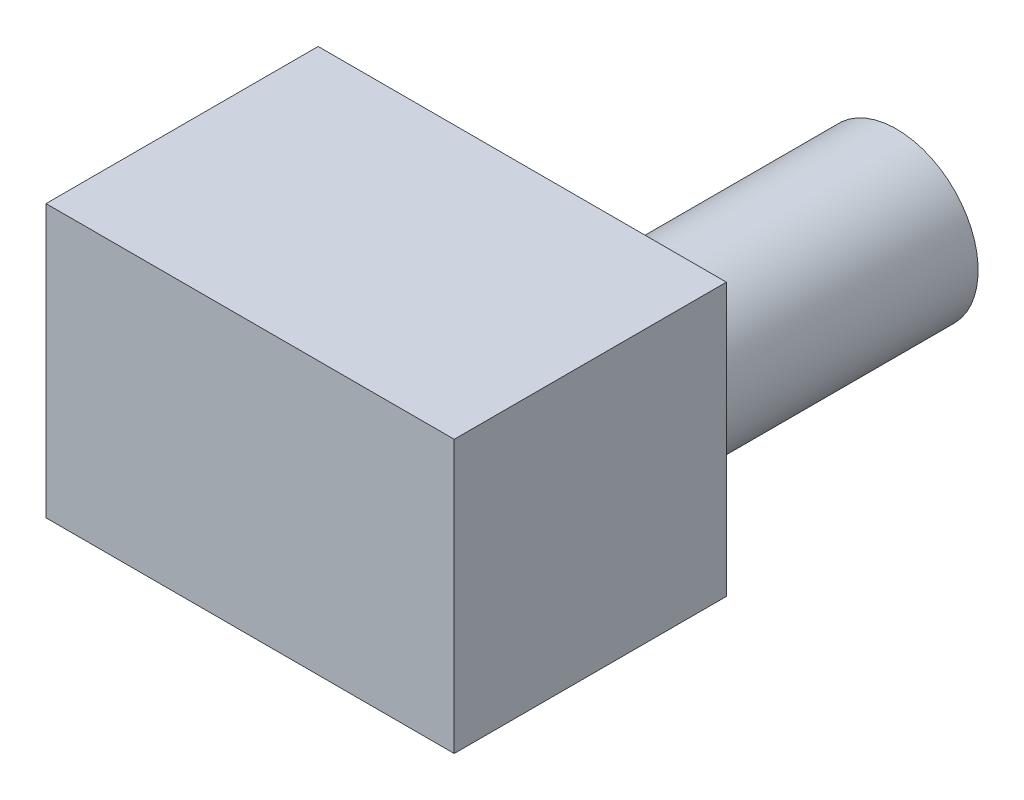
ISO-10303-21;
HEADER;
FILE_DESCRIPTION(('STEP AP214'),'2;1');
FILE_NAME('part.step','',(''),(''),'','','');
FILE_SCHEMA(('AUTOMOTIVE_DESIGN { 1 0 10303 214 1 1 1 1 }'));
ENDSEC;
DATA;
#1=APPLICATION_CONTEXT('core data for automotive mechanical design processes');
#2=APPLICATION_PROTOCOL_DEFINITION('international standard','automotive_design',2000,#1);
#3=PRODUCT_CONTEXT('',#1,'mechanical');
#4=PRODUCT('Part','Part','',(#3));
#5=PRODUCT_RELATED_PRODUCT_CATEGORY('part','',(#4));
#6=PRODUCT_DEFINITION_FORMATION('','',#4);
#7=PRODUCT_DEFINITION_CONTEXT('part definition',#1,'design');
#8=PRODUCT_DEFINITION('design','',#6,#7);
#9=PRODUCT_DEFINITION_SHAPE('','',#8);
#10=(LENGTH_UNIT() NAMED_UNIT(*) SI_UNIT(.MILLI.,.METRE.));
#11=(NAMED_UNIT(*) PLANE_ANGLE_UNIT() SI_UNIT($,.RADIAN.));
#12=(NAMED_UNIT(*) SI_UNIT($,.STERADIAN.) SOLID_ANGLE_UNIT());
#13=UNCERTAINTY_MEASURE_WITH_UNIT(LENGTH_MEASURE(1.E-05),#10,'distance_accuracy_value','');
#14=(GEOMETRIC_REPRESENTATION_CONTEXT(3) GLOBAL_UNCERTAINTY_ASSIGNED_CONTEXT((#13)) GLOBAL_UNIT_ASSIGNED_CONTEXT((#10,
#11,#12)) REPRESENTATION_CONTEXT('',''));
#15=CARTESIAN_POINT('',(0.,0.,0.));
#16=DIRECTION('',(0.,0.,1.));
#17=DIRECTION('',(1.,0.,0.));
#18=AXIS2_PLACEMENT_3D('',#15,#16,#17);
#19=CARTESIAN_POINT('',(3.75,-2.5,5.));
#20=DIRECTION('',(-1.,0.,0.));
#21=DIRECTION('',(0.,0.,1.));
#22=AXIS2_PLACEMENT_3D('',#19,#20,#21);
#23=PLANE('',#22);
#24=DIRECTION('',(0.,1.,0.));
#25=VECTOR('',#24,1.);
#26=CARTESIAN_POINT('',(3.75,-2.5,0.));
#27=LINE('',#26,#25);
#28=CARTESIAN_POINT('',(3.75,-2.5,0.));
#29=VERTEX_POINT('',#28);
#30=CARTESIAN_POINT('',(3.75,2.5,0.));
#31=VERTEX_POINT('',#30);
#32=EDGE_CURVE('E104',#29,#31,#27,.T.);
#33=ORIENTED_EDGE('',*,*,#32,.T.);
#34=DIRECTION('',(0.,0.,-1.));
#35=VECTOR('',#34,1.);
#36=CARTESIAN_POINT('',(3.75,2.5,5.));
#37=LINE('',#36,#35);
#38=CARTESIAN_POINT('',(3.75,2.5,5.));
#39=VERTEX_POINT('',#38);
#40=EDGE_CURVE('E11',#39,#31,#37,.T.);
#41=ORIENTED_EDGE('',*,*,#40,.F.);
#42=DIRECTION('',(0.,1.,0.));
#43=VECTOR('',#42,1.);
#44=CARTESIAN_POINT('',(3.75,-2.5,5.));
#45=LINE('',#44,#43);
#46=CARTESIAN_POINT('',(3.75,-2.5,5.));
#47=VERTEX_POINT('',#46);
#48=EDGE_CURVE('E92',#47,#39,#45,.T.);
#49=ORIENTED_EDGE('',*,*,#48,.F.);
#50=DIRECTION('',(0.,0.,-1.));
#51=VECTOR('',#50,1.);
#52=CARTESIAN_POINT('',(3.75,-2.5,5.));
#53=LINE('',#52,#51);
#54=EDGE_CURVE('E100',#47,#29,#53,.T.);
#55=ORIENTED_EDGE('',*,*,#54,.T.);
#56=EDGE_LOOP('',(#33,#41,#49,#55));
#57=FACE_BOUND('',#56,.T.);
#58=ADVANCED_FACE('F41',(#57),#23,.F.);
#59=CARTESIAN_POINT('',(-3.75,2.5,5.));
#60=DIRECTION('',(0.,-1.,0.));
#61=DIRECTION('',(0.,0.,-1.));
#62=AXIS2_PLACEMENT_3D('',#59,#60,#61);
#63=PLANE('',#62);
#64=DIRECTION('',(-1.,0.,0.));
#65=VECTOR('',#64,1.);
#66=CARTESIAN_POINT('',(-3.75,2.5,0.));
#67=LINE('',#66,#65);
#68=CARTESIAN_POINT('',(-3.75,2.5,0.));
#69=VERTEX_POINT('',#68);
#70=EDGE_CURVE('E96',#31,#69,#67,.T.);
#71=ORIENTED_EDGE('',*,*,#70,.T.);
#72=DIRECTION('',(0.,0.,-1.));
#73=VECTOR('',#72,1.);
#74=CARTESIAN_POINT('',(-3.75,2.5,5.));
#75=LINE('',#74,#73);
#76=CARTESIAN_POINT('',(-3.75,2.5,5.));
#77=VERTEX_POINT('',#76);
#78=EDGE_CURVE('E49',#77,#69,#75,.T.);
#79=ORIENTED_EDGE('',*,*,#78,.F.);
#80=DIRECTION('',(-1.,0.,0.));
#81=VECTOR('',#80,1.);
#82=CARTESIAN_POINT('',(-3.75,2.5,5.));
#83=LINE('',#82,#81);
#84=EDGE_CURVE('E87',#39,#77,#83,.T.);
#85=ORIENTED_EDGE('',*,*,#84,.F.);
#86=ORIENTED_EDGE('',*,*,#40,.T.);
#87=EDGE_LOOP('',(#71,#79,#85,#86));
#88=FACE_BOUND('',#87,.T.);
#89=ADVANCED_FACE('F95',(#88),#63,.F.);
#90=CARTESIAN_POINT('',(-3.75,-2.5,5.));
#91=DIRECTION('',(1.,0.,0.));
#92=DIRECTION('',(0.,0.,-1.));
#93=AXIS2_PLACEMENT_3D('',#90,#91,#92);
#94=PLANE('',#93);
#95=DIRECTION('',(0.,-1.,0.));
#96=VECTOR('',#95,1.);
#97=CARTESIAN_POINT('',(-3.75,-2.5,0.));
#98=LINE('',#97,#96);
#99=CARTESIAN_POINT('',(-3.75,-2.5,0.));
#100=VERTEX_POINT('',#99);
#101=EDGE_CURVE('E74',#69,#100,#98,.T.);
#102=ORIENTED_EDGE('',*,*,#101,.T.);
#103=DIRECTION('',(0.,0.,-1.));
#104=VECTOR('',#103,1.);
#105=CARTESIAN_POINT('',(-3.75,-2.5,5.));
#106=LINE('',#105,#104);
#107=CARTESIAN_POINT('',(-3.75,-2.5,5.));
#108=VERTEX_POINT('',#107);
#109=EDGE_CURVE('E97',#108,#100,#106,.T.);
#110=ORIENTED_EDGE('',*,*,#109,.F.);
#111=DIRECTION('',(0.,-1.,0.));
#112=VECTOR('',#111,1.);
#113=CARTESIAN_POINT('',(-3.75,-2.5,5.));
#114=LINE('',#113,#112);
#115=EDGE_CURVE('E90',#77,#108,#114,.T.);
#116=ORIENTED_EDGE('',*,*,#115,.F.);
#117=ORIENTED_EDGE('',*,*,#78,.T.);
#118=EDGE_LOOP('',(#102,#110,#116,#117));
#119=FACE_BOUND('',#118,.T.);
#120=ADVANCED_FACE('F98',(#119),#94,.F.);
#121=CARTESIAN_POINT('',(-3.75,-2.5,5.));
#122=DIRECTION('',(0.,1.,0.));
#123=DIRECTION('',(0.,0.,1.));
#124=AXIS2_PLACEMENT_3D('',#121,#122,#123);
#125=PLANE('',#124);
#126=DIRECTION('',(1.,0.,0.));
#127=VECTOR('',#126,1.);
#128=CARTESIAN_POINT('',(-3.75,-2.5,0.));
#129=LINE('',#128,#127);
#130=EDGE_CURVE('E80',#100,#29,#129,.T.);
#131=ORIENTED_EDGE('',*,*,#130,.T.);
#132=ORIENTED_EDGE('',*,*,#54,.F.);
#133=DIRECTION('',(1.,0.,0.));
#134=VECTOR('',#133,1.);
#135=CARTESIAN_POINT('',(-3.75,-2.5,5.));
#136=LINE('',#135,#134);
#137=EDGE_CURVE('E57',#108,#47,#136,.T.);
#138=ORIENTED_EDGE('',*,*,#137,.F.);
#139=ORIENTED_EDGE('',*,*,#109,.T.);
#140=EDGE_LOOP('',(#131,#132,#138,#139));
#141=FACE_BOUND('',#140,.T.);
#142=ADVANCED_FACE('F112',(#141),#125,.F.);
#143=CARTESIAN_POINT('',(0.,0.,5.));
#144=DIRECTION('',(0.,0.,-1.));
#145=DIRECTION('',(-1.,0.,0.));
#146=AXIS2_PLACEMENT_3D('',#143,#144,#145);
#147=PLANE('',#146);
#148=ORIENTED_EDGE('',*,*,#48,.T.);
#149=ORIENTED_EDGE('',*,*,#84,.T.);
#150=ORIENTED_EDGE('',*,*,#115,.T.);
#151=ORIENTED_EDGE('',*,*,#137,.T.);
#152=EDGE_LOOP('',(#148,#149,#150,#151));
#153=FACE_BOUND('',#152,.T.);
#154=ADVANCED_FACE('F88',(#153),#147,.F.);
#155=CARTESIAN_POINT('',(0.,0.,0.));
#156=DIRECTION('',(0.,0.,-1.));
#157=DIRECTION('',(-1.,0.,0.));
#158=AXIS2_PLACEMENT_3D('',#155,#156,#157);
#159=PLANE('',#158);
#160=CARTESIAN_POINT('',(1.875,0.,0.));
#161=DIRECTION('',(0.,0.,-1.));
#162=DIRECTION('',(-1.,0.,0.));
#163=AXIS2_PLACEMENT_3D('',#160,#161,#162);
#164=CIRCLE('',#163,1.5);
#165=CARTESIAN_POINT('',(0.375,0.,0.));
#166=VERTEX_POINT('',#165);
#167=EDGE_CURVE('E118',#166,#166,#164,.T.);
#168=ORIENTED_EDGE('',*,*,#167,.F.);
#169=EDGE_LOOP('',(#168));
#170=FACE_BOUND('',#169,.T.);
#171=ORIENTED_EDGE('',*,*,#32,.F.);
#172=ORIENTED_EDGE('',*,*,#130,.F.);
#173=ORIENTED_EDGE('',*,*,#101,.F.);
#174=ORIENTED_EDGE('',*,*,#70,.F.);
#175=EDGE_LOOP('',(#171,#172,#173,#174));
#176=FACE_BOUND('',#175,.T.);
#177=ADVANCED_FACE('F115',(#170,#176),#159,.T.);
#178=CARTESIAN_POINT('',(1.875,0.,-5.));
#179=DIRECTION('',(0.,0.,1.));
#180=DIRECTION('',(1.,0.,0.));
#181=AXIS2_PLACEMENT_3D('',#178,#179,#180);
#182=CYLINDRICAL_SURFACE('',#181,1.5);
#183=CARTESIAN_POINT('',(1.875,0.,-5.));
#184=DIRECTION('',(0.,0.,-1.));
#185=DIRECTION('',(-1.,0.,0.));
#186=AXIS2_PLACEMENT_3D('',#183,#184,#185);
#187=CIRCLE('',#186,1.5);
#188=CARTESIAN_POINT('',(0.375,0.,-5.));
#189=VERTEX_POINT('',#188);
#190=EDGE_CURVE('E107',#189,#189,#187,.T.);
#191=ORIENTED_EDGE('',*,*,#190,.F.);
#192=EDGE_LOOP('',(#191));
#193=FACE_BOUND('',#192,.T.);
#194=ORIENTED_EDGE('',*,*,#167,.T.);
#195=EDGE_LOOP('',(#194));
#196=FACE_BOUND('',#195,.T.);
#197=ADVANCED_FACE('F126',(#193,#196),#182,.T.);
#198=CARTESIAN_POINT('',(0.,0.,-5.));
#199=DIRECTION('',(0.,0.,-1.));
#200=DIRECTION('',(-1.,0.,0.));
#201=AXIS2_PLACEMENT_3D('',#198,#199,#200);
#202=PLANE('',#201);
#203=ORIENTED_EDGE('',*,*,#190,.T.);
#204=EDGE_LOOP('',(#203));
#205=FACE_BOUND('',#204,.T.);
#206=ADVANCED_FACE('F124',(#205),#202,.T.);
#207=CLOSED_SHELL('',(#58,#89,#120,#142,#154,#177,#197,#206));
#208=MANIFOLD_SOLID_BREP('B2',#207);
#209=ADVANCED_BREP_SHAPE_REPRESENTATION('',(#18,#208),#14);
#210=SHAPE_DEFINITION_REPRESENTATION(#9,#209);
ENDSEC;
END-ISO-10303-21;
